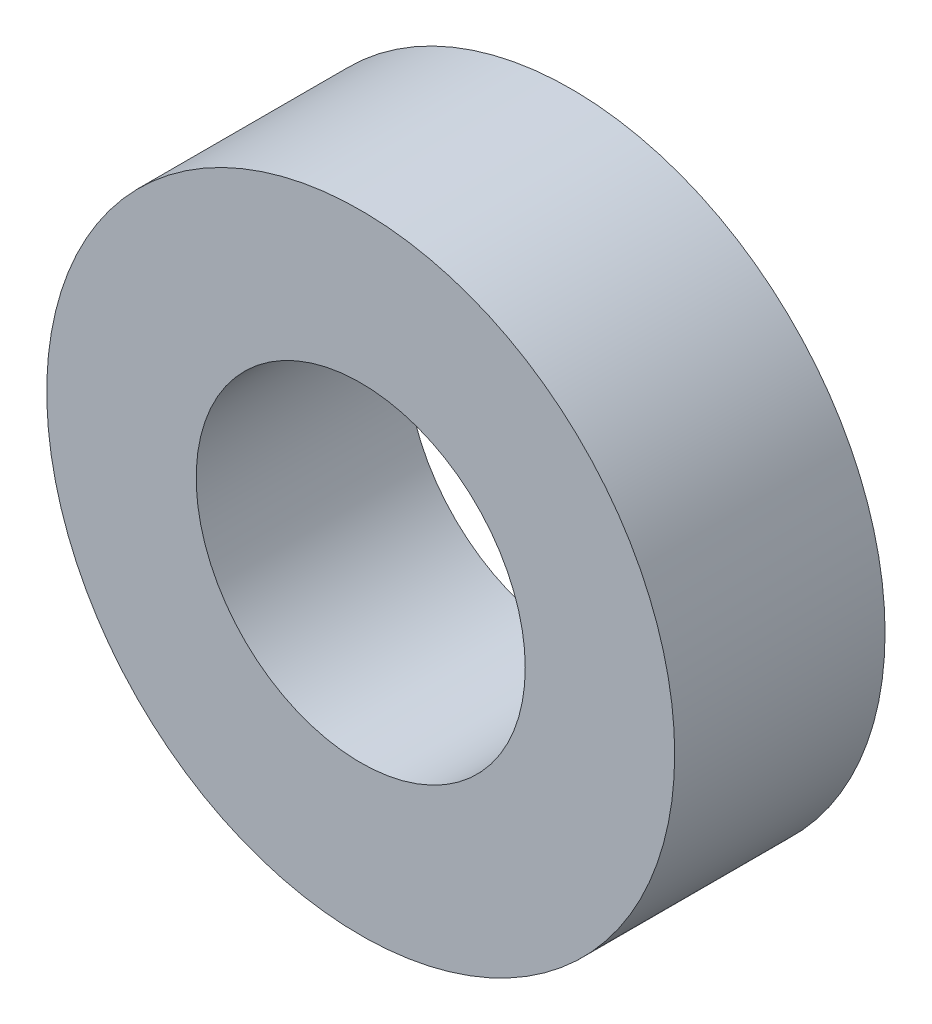
ISO-10303-21;
HEADER;
FILE_DESCRIPTION(('STEP AP214'),'2;1');
FILE_NAME('part.step','',(''),(''),'','','');
FILE_SCHEMA(('AUTOMOTIVE_DESIGN { 1 0 10303 214 1 1 1 1 }'));
ENDSEC;
DATA;
#1=APPLICATION_CONTEXT('core data for automotive mechanical design processes');
#2=APPLICATION_PROTOCOL_DEFINITION('international standard','automotive_design',2000,#1);
#3=PRODUCT_CONTEXT('',#1,'mechanical');
#4=PRODUCT('Part','Part','',(#3));
#5=PRODUCT_RELATED_PRODUCT_CATEGORY('part','',(#4));
#6=PRODUCT_DEFINITION_FORMATION('','',#4);
#7=PRODUCT_DEFINITION_CONTEXT('part definition',#1,'design');
#8=PRODUCT_DEFINITION('design','',#6,#7);
#9=PRODUCT_DEFINITION_SHAPE('','',#8);
#10=(LENGTH_UNIT() NAMED_UNIT(*) SI_UNIT(.MILLI.,.METRE.));
#11=(NAMED_UNIT(*) PLANE_ANGLE_UNIT() SI_UNIT($,.RADIAN.));
#12=(NAMED_UNIT(*) SI_UNIT($,.STERADIAN.) SOLID_ANGLE_UNIT());
#13=UNCERTAINTY_MEASURE_WITH_UNIT(LENGTH_MEASURE(1.E-05),#10,'distance_accuracy_value','');
#14=(GEOMETRIC_REPRESENTATION_CONTEXT(3) GLOBAL_UNCERTAINTY_ASSIGNED_CONTEXT((#13)) GLOBAL_UNIT_ASSIGNED_CONTEXT((#10,
#11,#12)) REPRESENTATION_CONTEXT('',''));
#15=CARTESIAN_POINT('',(0.,0.,0.));
#16=DIRECTION('',(0.,0.,1.));
#17=DIRECTION('',(1.,0.,0.));
#18=AXIS2_PLACEMENT_3D('',#15,#16,#17);
#19=CARTESIAN_POINT('',(0.,0.,3.18262));
#20=DIRECTION('',(0.,0.,1.));
#21=DIRECTION('',(1.,0.,0.));
#22=AXIS2_PLACEMENT_3D('',#19,#20,#21);
#23=PLANE('',#22);
#24=CARTESIAN_POINT('',(0.,0.,3.18262));
#25=DIRECTION('',(0.,0.,1.));
#26=DIRECTION('',(1.,0.,0.));
#27=AXIS2_PLACEMENT_3D('',#24,#25,#26);
#28=CIRCLE('',#27,4.7498);
#29=CARTESIAN_POINT('',(4.7498,0.,3.18262));
#30=VERTEX_POINT('',#29);
#31=EDGE_CURVE('E10',#30,#30,#28,.T.);
#32=ORIENTED_EDGE('',*,*,#31,.T.);
#33=EDGE_LOOP('',(#32));
#34=FACE_BOUND('',#33,.T.);
#35=CARTESIAN_POINT('',(0.,0.,3.18262));
#36=DIRECTION('',(0.,0.,1.));
#37=DIRECTION('',(1.,0.,0.));
#38=AXIS2_PLACEMENT_3D('',#35,#36,#37);
#39=CIRCLE('',#38,2.4892);
#40=CARTESIAN_POINT('',(2.4892,0.,3.18262));
#41=VERTEX_POINT('',#40);
#42=EDGE_CURVE('E50',#41,#41,#39,.T.);
#43=ORIENTED_EDGE('',*,*,#42,.F.);
#44=EDGE_LOOP('',(#43));
#45=FACE_BOUND('',#44,.T.);
#46=ADVANCED_FACE('F39',(#34,#45),#23,.T.);
#47=CARTESIAN_POINT('',(0.,0.,0.));
#48=DIRECTION('',(0.,0.,1.));
#49=DIRECTION('',(1.,0.,0.));
#50=AXIS2_PLACEMENT_3D('',#47,#48,#49);
#51=PLANE('',#50);
#52=CARTESIAN_POINT('',(0.,0.,0.));
#53=DIRECTION('',(0.,0.,1.));
#54=DIRECTION('',(1.,0.,0.));
#55=AXIS2_PLACEMENT_3D('',#52,#53,#54);
#56=CIRCLE('',#55,4.7498);
#57=CARTESIAN_POINT('',(4.7498,0.,0.));
#58=VERTEX_POINT('',#57);
#59=EDGE_CURVE('E43',#58,#58,#56,.T.);
#60=ORIENTED_EDGE('',*,*,#59,.F.);
#61=EDGE_LOOP('',(#60));
#62=FACE_BOUND('',#61,.T.);
#63=CARTESIAN_POINT('',(0.,0.,0.));
#64=DIRECTION('',(0.,0.,1.));
#65=DIRECTION('',(1.,0.,0.));
#66=AXIS2_PLACEMENT_3D('',#63,#64,#65);
#67=CIRCLE('',#66,2.4892);
#68=CARTESIAN_POINT('',(2.4892,0.,0.));
#69=VERTEX_POINT('',#68);
#70=EDGE_CURVE('E52',#69,#69,#67,.T.);
#71=ORIENTED_EDGE('',*,*,#70,.T.);
#72=EDGE_LOOP('',(#71));
#73=FACE_BOUND('',#72,.T.);
#74=ADVANCED_FACE('F62',(#62,#73),#51,.F.);
#75=CARTESIAN_POINT('',(0.,0.,3.18262));
#76=DIRECTION('',(0.,0.,-1.));
#77=DIRECTION('',(-1.,0.,0.));
#78=AXIS2_PLACEMENT_3D('',#75,#76,#77);
#79=CYLINDRICAL_SURFACE('',#78,4.7498);
#80=ORIENTED_EDGE('',*,*,#31,.F.);
#81=EDGE_LOOP('',(#80));
#82=FACE_BOUND('',#81,.T.);
#83=ORIENTED_EDGE('',*,*,#59,.T.);
#84=EDGE_LOOP('',(#83));
#85=FACE_BOUND('',#84,.T.);
#86=ADVANCED_FACE('F41',(#82,#85),#79,.T.);
#87=CARTESIAN_POINT('',(0.,0.,3.18262));
#88=DIRECTION('',(0.,0.,-1.));
#89=DIRECTION('',(-1.,0.,0.));
#90=AXIS2_PLACEMENT_3D('',#87,#88,#89);
#91=CYLINDRICAL_SURFACE('',#90,2.4892);
#92=ORIENTED_EDGE('',*,*,#42,.T.);
#93=EDGE_LOOP('',(#92));
#94=FACE_BOUND('',#93,.T.);
#95=ORIENTED_EDGE('',*,*,#70,.F.);
#96=EDGE_LOOP('',(#95));
#97=FACE_BOUND('',#96,.T.);
#98=ADVANCED_FACE('F58',(#94,#97),#91,.F.);
#99=CLOSED_SHELL('',(#46,#74,#86,#98));
#100=MANIFOLD_SOLID_BREP('B2',#99);
#101=ADVANCED_BREP_SHAPE_REPRESENTATION('',(#18,#100),#14);
#102=SHAPE_DEFINITION_REPRESENTATION(#9,#101);
ENDSEC;
END-ISO-10303-21;
